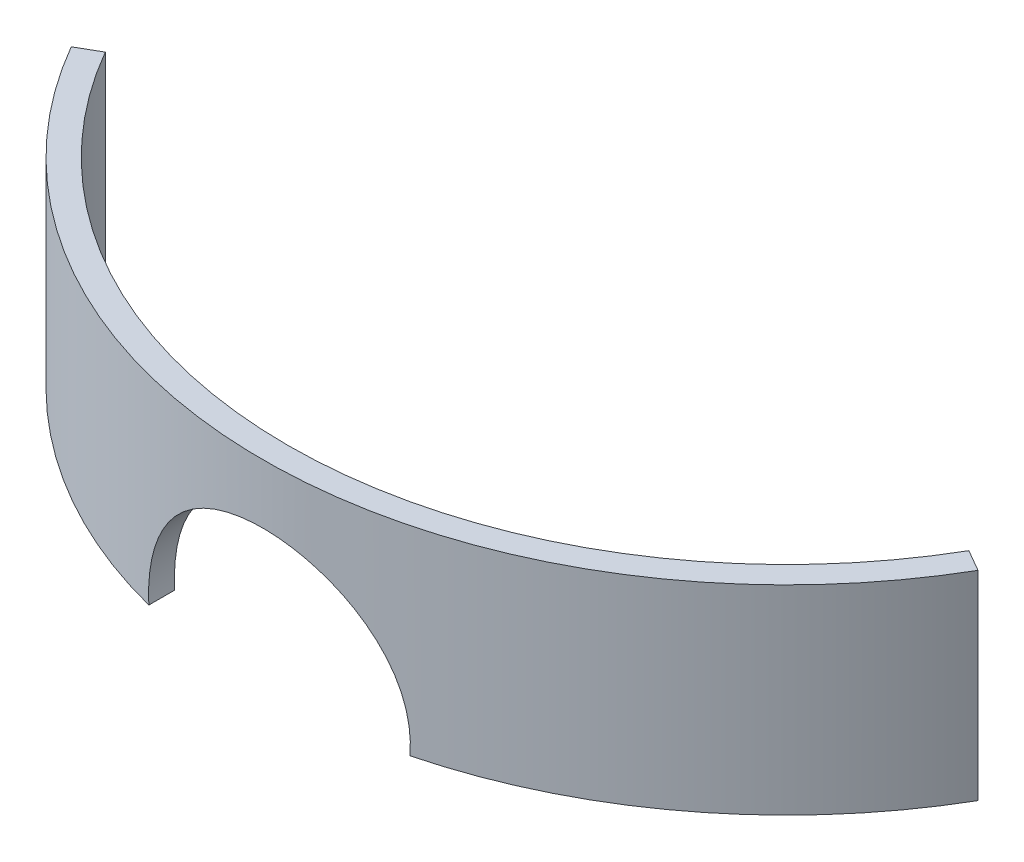
ISO-10303-21;
HEADER;
FILE_DESCRIPTION(('STEP AP214'),'2;1');
FILE_NAME('part.step','',(''),(''),'','','');
FILE_SCHEMA(('AUTOMOTIVE_DESIGN { 1 0 10303 214 1 1 1 1 }'));
ENDSEC;
DATA;
#1=APPLICATION_CONTEXT('core data for automotive mechanical design processes');
#2=APPLICATION_PROTOCOL_DEFINITION('international standard','automotive_design',2000,#1);
#3=PRODUCT_CONTEXT('',#1,'mechanical');
#4=PRODUCT('Part','Part','',(#3));
#5=PRODUCT_RELATED_PRODUCT_CATEGORY('part','',(#4));
#6=PRODUCT_DEFINITION_FORMATION('','',#4);
#7=PRODUCT_DEFINITION_CONTEXT('part definition',#1,'design');
#8=PRODUCT_DEFINITION('design','',#6,#7);
#9=PRODUCT_DEFINITION_SHAPE('','',#8);
#10=(LENGTH_UNIT() NAMED_UNIT(*) SI_UNIT(.MILLI.,.METRE.));
#11=(NAMED_UNIT(*) PLANE_ANGLE_UNIT() SI_UNIT($,.RADIAN.));
#12=(NAMED_UNIT(*) SI_UNIT($,.STERADIAN.) SOLID_ANGLE_UNIT());
#13=UNCERTAINTY_MEASURE_WITH_UNIT(LENGTH_MEASURE(1.E-05),#10,'distance_accuracy_value','');
#14=(GEOMETRIC_REPRESENTATION_CONTEXT(3) GLOBAL_UNCERTAINTY_ASSIGNED_CONTEXT((#13)) GLOBAL_UNIT_ASSIGNED_CONTEXT((#10,
#11,#12)) REPRESENTATION_CONTEXT('',''));
#15=CARTESIAN_POINT('',(0.,0.,0.));
#16=DIRECTION('',(0.,0.,1.));
#17=DIRECTION('',(1.,0.,0.));
#18=AXIS2_PLACEMENT_3D('',#15,#16,#17);
#19=CARTESIAN_POINT('',(0.,36.5,0.));
#20=DIRECTION('',(0.,1.,0.));
#21=DIRECTION('',(0.,0.,1.));
#22=AXIS2_PLACEMENT_3D('',#19,#20,#21);
#23=PLANE('',#22);
#24=CARTESIAN_POINT('',(0.,36.5,0.));
#25=DIRECTION('',(0.,1.,0.));
#26=DIRECTION('',(0.,0.,1.));
#27=AXIS2_PLACEMENT_3D('',#24,#25,#26);
#28=CIRCLE('',#27,40.);
#29=CARTESIAN_POINT('',(-34.6410161513776,36.5,19.9999999999999));
#30=VERTEX_POINT('',#29);
#31=CARTESIAN_POINT('',(-10.4731800328267,36.5,38.6045657921443));
#32=VERTEX_POINT('',#31);
#33=EDGE_CURVE('E187',#30,#32,#28,.T.);
#34=ORIENTED_EDGE('',*,*,#33,.T.);
#35=DIRECTION('',(0.,0.,1.));
#36=VECTOR('',#35,1.);
#37=CARTESIAN_POINT('',(-10.4731800328267,36.5,38.));
#38=LINE('',#37,#36);
#39=CARTESIAN_POINT('',(-10.4731800328267,36.5,40.6732405888687));
#40=VERTEX_POINT('',#39);
#41=EDGE_CURVE('E49',#40,#32,#38,.F.);
#42=ORIENTED_EDGE('',*,*,#41,.F.);
#43=CARTESIAN_POINT('',(0.,36.5,0.));
#44=DIRECTION('',(0.,1.,0.));
#45=DIRECTION('',(0.,0.,1.));
#46=AXIS2_PLACEMENT_3D('',#43,#44,#45);
#47=CIRCLE('',#46,42.);
#48=CARTESIAN_POINT('',(-36.3730669589465,36.5,20.9999999999999));
#49=VERTEX_POINT('',#48);
#50=EDGE_CURVE('E55',#40,#49,#47,.F.);
#51=ORIENTED_EDGE('',*,*,#50,.T.);
#52=DIRECTION('',(-0.86602540378444,0.,0.499999999999998));
#53=VECTOR('',#52,1.);
#54=CARTESIAN_POINT('',(0.,36.5,0.));
#55=LINE('',#54,#53);
#56=EDGE_CURVE('E133',#30,#49,#55,.T.);
#57=ORIENTED_EDGE('',*,*,#56,.F.);
#58=EDGE_LOOP('',(#34,#42,#51,#57));
#59=FACE_BOUND('',#58,.T.);
#60=ADVANCED_FACE('F45',(#59),#23,.F.);
#61=CARTESIAN_POINT('',(10.4731800328267,36.5,38.6045657921443));
#62=VERTEX_POINT('',#61);
#63=CARTESIAN_POINT('',(34.6410161513776,36.5,19.9999999999999));
#64=VERTEX_POINT('',#63);
#65=EDGE_CURVE('E190',#62,#64,#28,.T.);
#66=ORIENTED_EDGE('',*,*,#65,.T.);
#67=DIRECTION('',(0.86602540378444,0.,0.499999999999998));
#68=VECTOR('',#67,1.);
#69=CARTESIAN_POINT('',(0.,36.5,0.));
#70=LINE('',#69,#68);
#71=CARTESIAN_POINT('',(36.3730669589465,36.5,20.9999999999999));
#72=VERTEX_POINT('',#71);
#73=EDGE_CURVE('E110',#64,#72,#70,.T.);
#74=ORIENTED_EDGE('',*,*,#73,.T.);
#75=CARTESIAN_POINT('',(10.4731800328267,36.5,40.6732405888687));
#76=VERTEX_POINT('',#75);
#77=EDGE_CURVE('E12',#72,#76,#47,.F.);
#78=ORIENTED_EDGE('',*,*,#77,.T.);
#79=DIRECTION('',(0.,0.,1.));
#80=VECTOR('',#79,1.);
#81=CARTESIAN_POINT('',(10.4731800328267,36.5,38.));
#82=LINE('',#81,#80);
#83=EDGE_CURVE('E70',#62,#76,#82,.T.);
#84=ORIENTED_EDGE('',*,*,#83,.F.);
#85=EDGE_LOOP('',(#66,#74,#78,#84));
#86=FACE_BOUND('',#85,.T.);
#87=ADVANCED_FACE('F47',(#86),#23,.F.);
#88=CARTESIAN_POINT('',(0.,37.25,38.));
#89=DIRECTION('',(0.,0.,1.));
#90=DIRECTION('',(1.,0.,0.));
#91=AXIS2_PLACEMENT_3D('',#88,#89,#90);
#92=CYLINDRICAL_SURFACE('',#91,10.5);
#93=CARTESIAN_POINT('',(10.5,37.25,40.6663251351779));
#94=CARTESIAN_POINT('',(10.49999876565,37.539930966892,40.6663258994178));
#95=CARTESIAN_POINT('',(10.4879811835644,37.829886594567,40.6694341838603));
#96=CARTESIAN_POINT('',(10.4400096313822,38.407698066371,40.6817747835226));
#97=CARTESIAN_POINT('',(10.4040529167803,38.6955536659162,40.691007800913));
#98=CARTESIAN_POINT('',(10.3084863846881,39.2672076169297,40.715323130303));
#99=CARTESIAN_POINT('',(10.2488648562142,39.5510038874126,40.7304083382868));
#100=CARTESIAN_POINT('',(10.1064647926944,40.1123821028593,40.7659753539258));
#101=CARTESIAN_POINT('',(10.0236856806036,40.3899638927834,40.7864572960569));
#102=CARTESIAN_POINT('',(9.83576258315023,40.9366249188232,40.8321822092736));
#103=CARTESIAN_POINT('',(9.73064855122444,41.2057149935392,40.8574187987989));
#104=CARTESIAN_POINT('',(9.49879553260811,41.7339816969109,40.9119427018794));
#105=CARTESIAN_POINT('',(9.37205643161799,41.9931582731597,40.9412300368447));
#106=CARTESIAN_POINT('',(9.09789946782641,42.4998757543217,41.0030237527122));
#107=CARTESIAN_POINT('',(8.95048471642567,42.7474184025115,41.0355296490492));
#108=CARTESIAN_POINT('',(8.63593646788612,43.2294187026802,41.1028766535426));
#109=CARTESIAN_POINT('',(8.46879643879707,43.4638719820915,41.1377185335921));
#110=CARTESIAN_POINT('',(8.11247284094553,43.9226147797853,41.2094825190038));
#111=CARTESIAN_POINT('',(7.92292004464524,44.146613289811,41.2464320754733));
#112=CARTESIAN_POINT('',(7.52577773862763,44.5779336907137,41.3207389842765));
#113=CARTESIAN_POINT('',(7.31818803569293,44.7852554028973,41.358096340975));
#114=CARTESIAN_POINT('',(6.88627382126853,45.1819118671456,41.4322005749668));
#115=CARTESIAN_POINT('',(6.66194482256683,45.3712417650955,41.4689472853163));
#116=CARTESIAN_POINT('',(6.19814207443449,45.7305101006566,41.5408001243608));
#117=CARTESIAN_POINT('',(5.95867366473017,45.9004553166646,41.5759068239803));
#118=CARTESIAN_POINT('',(5.46258913082245,46.2221090069665,41.6440112735241));
#119=CARTESIAN_POINT('',(5.20577809053642,46.3735249088809,41.6769720859321));
#120=CARTESIAN_POINT('',(4.67986291381815,46.6541328473766,41.739297921382));
#121=CARTESIAN_POINT('',(4.41075862798324,46.783324613772,41.7686629007069));
#122=CARTESIAN_POINT('',(3.86217426858199,47.0184520218932,41.8229549887678));
#123=CARTESIAN_POINT('',(3.58269538187436,47.1243903142991,41.8478826032608));
#124=CARTESIAN_POINT('',(3.01535083082675,47.3121536734467,41.8925842343201));
#125=CARTESIAN_POINT('',(2.72748536142295,47.3939793001682,41.9123583705668));
#126=CARTESIAN_POINT('',(2.15139839462525,47.5314100457595,41.945834598986));
#127=CARTESIAN_POINT('',(1.86330222869606,47.5875127270053,41.9596515761009));
#128=CARTESIAN_POINT('',(1.28320599123755,47.6754226633,41.9813961063182));
#129=CARTESIAN_POINT('',(0.991205967432573,47.7072302150791,41.9893237313504));
#130=CARTESIAN_POINT('',(0.40550358689464,47.7462707435253,41.9990635756304));
#131=CARTESIAN_POINT('',(0.111801454152335,47.7535068832951,42.0008765820189));
#132=CARTESIAN_POINT('',(-0.475147856371557,47.7433495336084,41.9983375773534));
#133=CARTESIAN_POINT('',(-0.768395039757887,47.7259563500237,41.9939856428618));
#134=CARTESIAN_POINT('',(-1.34575552096959,47.6673538160739,41.979405434013));
#135=CARTESIAN_POINT('',(-1.62992697033254,47.6266823678564,41.9693099100779));
#136=CARTESIAN_POINT('',(-2.19374210007774,47.52227777158,41.9436185028907));
#137=CARTESIAN_POINT('',(-2.47338585888854,47.458545023436,41.9280227150208));
#138=CARTESIAN_POINT('',(-3.02622570697781,47.308528584417,41.8917498488724));
#139=CARTESIAN_POINT('',(-3.29942158288901,47.2222441484204,41.8710726027008));
#140=CARTESIAN_POINT('',(-3.83751923654744,47.0277957436901,41.8251882202315));
#141=CARTESIAN_POINT('',(-4.10242089634325,46.9196314639679,41.7999810195481));
#142=CARTESIAN_POINT('',(-4.62448807755313,46.6811817684835,41.7454620950081));
#143=CARTESIAN_POINT('',(-4.88156462268641,46.5507094368611,41.7161160900265));
#144=CARTESIAN_POINT('',(-5.38393096394505,46.2692141539857,41.6542599459473));
#145=CARTESIAN_POINT('',(-5.6292163390553,46.118183574644,41.6217486336509));
#146=CARTESIAN_POINT('',(-6.10628012775464,45.7966986438378,41.5544386000016));
#147=CARTESIAN_POINT('',(-6.33806202809607,45.6262493404084,41.519640474113));
#148=CARTESIAN_POINT('',(-6.7868390408404,45.2669496137576,41.4486484798765));
#149=CARTESIAN_POINT('',(-7.00382731085306,45.0780907725207,41.4124539776302));
#150=CARTESIAN_POINT('',(-7.42721045725944,44.6778985229277,41.3386498357945));
#151=CARTESIAN_POINT('',(-7.63315899855915,44.4660948106937,41.3010284250394));
#152=CARTESIAN_POINT('',(-8.02644560431087,44.0259309074279,41.2264020673759));
#153=CARTESIAN_POINT('',(-8.21379171966896,43.7975779533833,41.1893968596045));
#154=CARTESIAN_POINT('',(-8.56878352344797,43.3256216499892,41.1170133909128));
#155=CARTESIAN_POINT('',(-8.73641981607102,43.0820111113815,41.0816359107924));
#156=CARTESIAN_POINT('',(-9.05063830179159,42.5813469643087,41.0135561744513));
#157=CARTESIAN_POINT('',(-9.1972287308938,42.3242986685376,40.9808528738961));
#158=CARTESIAN_POINT('',(-9.46903659052353,41.7970599244201,40.9189062196095));
#159=CARTESIAN_POINT('',(-9.59414167810802,41.526809354275,40.8896812838975));
#160=CARTESIAN_POINT('',(-9.82108014432877,40.9762626549945,40.8357686175122));
#161=CARTESIAN_POINT('',(-9.92291337568064,40.6959664622947,40.8110809155548));
#162=CARTESIAN_POINT('',(-10.1024487792678,40.1273926581839,40.7670097127501));
#163=CARTESIAN_POINT('',(-10.1801551835511,39.8391164562066,40.7476252817356));
#164=CARTESIAN_POINT('',(-10.3107871355234,39.2566732340095,40.7147665495915));
#165=CARTESIAN_POINT('',(-10.3637133369938,38.9625063694179,40.7012920925384));
#166=CARTESIAN_POINT('',(-10.4432482414696,38.3783406813589,40.6809562862066));
#167=CARTESIAN_POINT('',(-10.4705154096398,38.0884371200137,40.6739295988705));
#168=CARTESIAN_POINT('',(-10.5008792342442,37.5072848751172,40.666101177457));
#169=CARTESIAN_POINT('',(-10.5039763144121,37.2160362152369,40.6652993342497));
#170=CARTESIAN_POINT('',(-10.4859741432635,36.6343640736992,40.669945054543));
#171=CARTESIAN_POINT('',(-10.464876947035,36.3439405240565,40.6753920872573));
#172=CARTESIAN_POINT('',(-10.3986734393912,35.7660249002392,40.6923672851));
#173=CARTESIAN_POINT('',(-10.3535672336683,35.4785328131654,40.7038954234581));
#174=CARTESIAN_POINT('',(-10.240667014885,34.9132390683719,40.7324448490815));
#175=CARTESIAN_POINT('',(-10.1732572464013,34.6353558111297,40.7493729401351));
#176=CARTESIAN_POINT('',(-10.0161263410345,34.0863407735608,40.7882796527726));
#177=CARTESIAN_POINT('',(-9.92640551517418,33.8152088991759,40.8102582039514));
#178=CARTESIAN_POINT('',(-9.7253525920657,33.2815213303243,40.8586367518171));
#179=CARTESIAN_POINT('',(-9.61402248528011,33.0189648485658,40.885036341245));
#180=CARTESIAN_POINT('',(-9.37051888907937,32.5039984009451,40.9415314030219));
#181=CARTESIAN_POINT('',(-9.23833744183229,32.2515923552997,40.9716282854539));
#182=CARTESIAN_POINT('',(-8.95135579942736,31.753880994851,41.0352925642836));
#183=CARTESIAN_POINT('',(-8.79617001050306,31.5088051004619,41.0689155050676));
#184=CARTESIAN_POINT('',(-8.46614461934886,31.0324117825139,41.1382161418834));
#185=CARTESIAN_POINT('',(-8.29129615560716,30.8011006347984,41.1738947608008));
#186=CARTESIAN_POINT('',(-7.92314212613811,30.3537882300663,41.246321153006));
#187=CARTESIAN_POINT('',(-7.72983388800981,30.1377891976777,41.2830690805593));
#188=CARTESIAN_POINT('',(-7.3261237291588,29.7226021926748,41.3566195699105));
#189=CARTESIAN_POINT('',(-7.11572921467841,29.5234070117708,41.3934221013199));
#190=CARTESIAN_POINT('',(-6.67354129401005,29.1381564159564,41.4670392172104));
#191=CARTESIAN_POINT('',(-6.44133918398516,28.9525652449502,41.5038302059524));
#192=CARTESIAN_POINT('',(-5.96192521021523,28.6016673667213,41.5754032545602));
#193=CARTESIAN_POINT('',(-5.71471894947814,28.4363531562844,41.6101860549917));
#194=CARTESIAN_POINT('',(-5.20683659069902,28.1271024556336,41.6767854631102));
#195=CARTESIAN_POINT('',(-4.94615829097185,27.9831694746607,41.7086015835661));
#196=CARTESIAN_POINT('',(-4.41316021900737,27.7178104171296,41.7683602504002));
#197=CARTESIAN_POINT('',(-4.14084061901733,27.596384007701,41.7963028540658));
#198=CARTESIAN_POINT('',(-3.58850590466417,27.3778072486205,41.847329339802));
#199=CARTESIAN_POINT('',(-3.30856170675119,27.2804857165716,41.8704472881012));
#200=CARTESIAN_POINT('',(-2.74108906656812,27.1097722283721,41.9114226213314));
#201=CARTESIAN_POINT('',(-2.45356063989941,27.0363802230006,41.9292800170828));
#202=CARTESIAN_POINT('',(-1.87307898335729,26.9141626169062,41.959218536774));
#203=CARTESIAN_POINT('',(-1.58012663397698,26.8653330644658,41.9713005898613));
#204=CARTESIAN_POINT('',(-0.99095446536132,26.7926530697666,41.9893422255741));
#205=CARTESIAN_POINT('',(-0.694734717905107,26.7688020798716,41.9953019424272));
#206=CARTESIAN_POINT('',(-0.109318549696251,26.7465949303237,42.0008501256156));
#207=CARTESIAN_POINT('',(0.17985098154051,26.7475662493294,42.0006066580087));
#208=CARTESIAN_POINT('',(0.757054952746141,26.7733439879946,41.9941682227566));
#209=CARTESIAN_POINT('',(1.04508941447114,26.798149948557,41.9879733697454));
#210=CARTESIAN_POINT('',(1.61794151912378,26.8713851923197,41.9698033174631));
#211=CARTESIAN_POINT('',(1.90275927399182,26.9198136508566,41.9578283199775));
#212=CARTESIAN_POINT('',(2.46716865801495,27.0398910769454,41.9284263935882));
#213=CARTESIAN_POINT('',(2.7467602637522,27.1115401485201,41.910999440261));
#214=CARTESIAN_POINT('',(3.2972771815532,27.2770299231337,41.8712756153804));
#215=CARTESIAN_POINT('',(3.56824122258445,27.3707483606933,41.8490056247451));
#216=CARTESIAN_POINT('',(4.10126196907902,27.5798598126271,41.8001349613551));
#217=CARTESIAN_POINT('',(4.36331873390184,27.6952526825259,41.7735343174676));
#218=CARTESIAN_POINT('',(4.87679979927522,27.9468521673157,41.7167058879834));
#219=CARTESIAN_POINT('',(5.12822500756022,28.0830570006574,41.6864784128989));
#220=CARTESIAN_POINT('',(5.6189656782439,28.3753828567869,41.6231722428436));
#221=CARTESIAN_POINT('',(5.85827647909167,28.5315114659747,41.5900924633616));
#222=CARTESIAN_POINT('',(6.3286787479458,28.8664954519473,41.5211471687502));
#223=CARTESIAN_POINT('',(6.55944388082957,29.0457994922279,41.4852343926851));
#224=CARTESIAN_POINT('',(7.00523466480502,29.4229966860375,41.4122896715305));
#225=CARTESIAN_POINT('',(7.22025307930323,29.6208982920938,41.3752572227906));
#226=CARTESIAN_POINT('',(7.63309832125273,30.033969435788,41.3010873515787));
#227=CARTESIAN_POINT('',(7.8309208931041,30.2491432227194,41.2639499054568));
#228=CARTESIAN_POINT('',(8.20793114426395,30.6952223273811,41.1906147063505));
#229=CARTESIAN_POINT('',(8.3871270541454,30.9261206216207,41.1544165436758));
#230=CARTESIAN_POINT('',(8.72901631752263,31.4068063060558,41.0832734011077));
#231=CARTESIAN_POINT('',(8.89132856572894,31.6568704741054,41.048365622754));
#232=CARTESIAN_POINT('',(9.19420457392386,32.1701031945705,40.9815892172669));
#233=CARTESIAN_POINT('',(9.33477643455901,32.4332668174732,40.9497194598482));
#234=CARTESIAN_POINT('',(9.59311229004219,32.9708534316127,40.88997157344));
#235=CARTESIAN_POINT('',(9.7108862650698,33.245271431996,40.862091699208));
#236=CARTESIAN_POINT('',(9.92274327943157,33.803514511397,40.8111633535301));
#237=CARTESIAN_POINT('',(10.0168299305722,34.08733814878,40.7881141456015));
#238=CARTESIAN_POINT('',(10.1650451363864,34.6079134478546,40.7513988738351));
#239=CARTESIAN_POINT('',(10.2233655164882,34.843414796281,40.736782642908));
#240=CARTESIAN_POINT('',(10.3235915808394,35.3180884545697,40.711498824818));
#241=CARTESIAN_POINT('',(10.365498431753,35.5572605022646,40.7008309570107));
#242=CARTESIAN_POINT('',(10.4326526665267,36.0381033942653,40.6836694772977));
#243=CARTESIAN_POINT('',(10.4578985582345,36.2797744604147,40.6771762392725));
#244=CARTESIAN_POINT('',(10.4915705512623,36.7642914648435,40.6685043100736));
#245=CARTESIAN_POINT('',(10.5000010339628,37.0071370805498,40.6663244950064));
#246=CARTESIAN_POINT('',(10.5,37.25,40.6663251351779));
#247=B_SPLINE_CURVE_WITH_KNOTS('',3,(#93,#94,#95,#96,#97,#98,#99,#100,#101,#102,#103,#104,#105,
#106,#107,#108,#109,#110,#111,#112,#113,#114,#115,#116,#117,#118,#119,#120,#121,#122,#123,#124,
#125,#126,#127,#128,#129,#130,#131,#132,#133,#134,#135,#136,#137,#138,#139,#140,#141,#142,#143,
#144,#145,#146,#147,#148,#149,#150,#151,#152,#153,#154,#155,#156,#157,#158,#159,#160,#161,#162,
#163,#164,#165,#166,#167,#168,#169,#170,#171,#172,#173,#174,#175,#176,#177,#178,#179,#180,#181,
#182,#183,#184,#185,#186,#187,#188,#189,#190,#191,#192,#193,#194,#195,#196,#197,#198,#199,#200,
#201,#202,#203,#204,#205,#206,#207,#208,#209,#210,#211,#212,#213,#214,#215,#216,#217,#218,#219,
#220,#221,#222,#223,#224,#225,#226,#227,#228,#229,#230,#231,#232,#233,#234,#235,#236,#237,#238,
#239,#240,#241,#242,#243,#244,#245,#246),.UNSPECIFIED.,.T.,.F.,(4,2,2,2,2,2,2,2,2,2,2,2,2,2,2,2,
2,2,2,2,2,2,2,2,2,2,2,2,2,2,2,2,2,2,2,2,2,2,2,2,2,2,2,2,2,2,2,2,2,2,2,2,2,2,2,2,2,2,2,2,2,2,2,2,
2,2,2,2,2,2,2,2,2,2,2,2,4),(0.,0.869570966645742,1.73924164255169,2.60934322920117,
3.47946649912938,4.34843012699018,5.21739834791168,6.08623594110854,6.95536205814345,
7.84160069388764,8.72784882448756,9.61433538621905,10.5005110066023,11.3992450669725,
12.2979900527743,13.1966325367294,14.0952541494435,14.9756727619092,15.8560806211508,
16.7363751402962,17.6166587271491,18.4773781377671,19.338082623038,20.1988155501121,
21.0595607120504,21.9279070918617,22.7965765522889,23.6650207089843,24.5338638533958,
25.4262485957709,26.3182454258246,27.2106657670332,28.1027359144677,28.9993371983855,
29.8959441566134,30.792393753488,31.6888196978025,32.5615582493555,33.4342815006127,
34.3069306273097,35.1795759124708,36.0379086316372,36.8962293860642,37.7544711167946,
38.6130411880936,39.4880978199538,40.3635504120943,41.2391299352225,42.114331933625,
43.0118385541862,43.9090120562103,44.8063326464882,45.7036399644034,46.5943794730311,
47.4851171494773,48.3757114741838,49.2662862728693,50.1327585863245,50.9992142103355,
51.8656395884683,52.7320688480308,53.5938065106701,54.4555384294263,55.3171966233493,
56.179183896387,57.0614730688231,57.9441651960182,58.8270751522094,59.7095933030719,
60.6089877316814,61.508046226944,62.4067102488474,63.3052371607493,64.0338164378976,
64.7623439186472,65.4909366373303,66.2193394909219),.UNSPECIFIED.);
#248=EDGE_CURVE('E143',#76,#40,#247,.T.);
#249=ORIENTED_EDGE('',*,*,#248,.T.);
#250=ORIENTED_EDGE('',*,*,#41,.T.);
#251=CARTESIAN_POINT('',(10.5,37.25,38.5972796968905));
#252=CARTESIAN_POINT('',(10.4999988988291,36.960588736193,38.5972804118852));
#253=CARTESIAN_POINT('',(10.4880242542829,36.6711561952156,38.6005436760224));
#254=CARTESIAN_POINT('',(10.4402268169875,36.0943966014271,38.6134984866802));
#255=CARTESIAN_POINT('',(10.4044016647375,35.8070697597737,38.6231906692053));
#256=CARTESIAN_POINT('',(10.309193895277,35.2364929140457,38.6487121090586));
#257=CARTESIAN_POINT('',(10.2498009040451,34.9532447622905,38.6645440689059));
#258=CARTESIAN_POINT('',(10.1079593002466,34.3929605711699,38.7018672443314));
#259=CARTESIAN_POINT('',(10.0255100817516,34.1159246952726,38.7233586086405));
#260=CARTESIAN_POINT('',(9.83836126756043,33.5703674169638,38.7713290484119));
#261=CARTESIAN_POINT('',(9.73369345673661,33.3018344746808,38.7978009928054));
#262=CARTESIAN_POINT('',(9.50284602422747,32.7746538587194,38.8549874233173));
#263=CARTESIAN_POINT('',(9.37666631224731,32.5160062265394,38.8857019272437));
#264=CARTESIAN_POINT('',(9.10373620116321,32.0102922066558,38.9505025215734));
#265=CARTESIAN_POINT('',(8.95698839892894,31.7632243621672,38.9845881861838));
#266=CARTESIAN_POINT('',(8.64387802325474,31.2821040493618,39.0552061574075));
#267=CARTESIAN_POINT('',(8.47750893959654,31.0480559390321,39.0917392743235));
#268=CARTESIAN_POINT('',(8.12247452611873,30.5895730615738,39.1670657491212));
#269=CARTESIAN_POINT('',(7.93340312265272,30.3654578849386,39.205890977363));
#270=CARTESIAN_POINT('',(7.53723018176892,29.9338553302547,39.2839778285451));
#271=CARTESIAN_POINT('',(7.33012843072499,29.7263681492727,39.3232394566512));
#272=CARTESIAN_POINT('',(6.89918025409599,29.3293198117377,39.401132718749));
#273=CARTESIAN_POINT('',(6.67532921559465,29.1397636263427,39.4397641755908));
#274=CARTESIAN_POINT('',(6.21245643152511,28.7799775962954,39.5153178719275));
#275=CARTESIAN_POINT('',(5.97344003477036,28.6097409960632,39.552240706194));
#276=CARTESIAN_POINT('',(5.47784334011696,28.287187392296,39.6239433634876));
#277=CARTESIAN_POINT('',(5.22104609673663,28.1351939365033,39.6586804048599));
#278=CARTESIAN_POINT('',(4.69506239537988,27.8534367901946,39.724383231993));
#279=CARTESIAN_POINT('',(4.42587577047835,27.7236733993009,39.7553489669214));
#280=CARTESIAN_POINT('',(3.8770308849222,27.4874245822639,39.8126203496639));
#281=CARTESIAN_POINT('',(3.59737394972804,27.3809362212738,39.8389265849345));
#282=CARTESIAN_POINT('',(3.02957806256849,27.1921094949666,39.8861228476483));
#283=CARTESIAN_POINT('',(2.74143932904096,27.109770508311,39.9070130144399));
#284=CARTESIAN_POINT('',(2.16530281060098,26.9715144041604,39.9423697233158));
#285=CARTESIAN_POINT('',(1.87744429406445,26.9150505978917,39.9569687441281));
#286=CARTESIAN_POINT('',(1.29776957569475,26.8263844979196,39.9799940258045));
#287=CARTESIAN_POINT('',(1.00595342701575,26.7941818786968,39.988420369489));
#288=CARTESIAN_POINT('',(0.420576252248345,26.7543262155735,39.9988599510817));
#289=CARTESIAN_POINT('',(0.12701547825227,26.7466697072906,40.0008740939931));
#290=CARTESIAN_POINT('',(-0.459687012780373,26.7559654663747,39.9984342133306));
#291=CARTESIAN_POINT('',(-0.752828735532976,26.7729173948035,39.9939802788432));
#292=CARTESIAN_POINT('',(-1.32934623179409,26.8305613952246,39.9789188671051));
#293=CARTESIAN_POINT('',(-1.61278538800602,26.8706620609276,39.9684647207168));
#294=CARTESIAN_POINT('',(-2.17517792240971,26.973797908393,39.9418057954001));
#295=CARTESIAN_POINT('',(-2.45413138627275,27.0368326515977,39.9256011264364));
#296=CARTESIAN_POINT('',(-3.00564214893487,27.185325428069,39.8878743835428));
#297=CARTESIAN_POINT('',(-3.27819922795917,27.2707842305833,39.8663521271968));
#298=CARTESIAN_POINT('',(-3.81508325126481,27.4634538647988,39.8185607714844));
#299=CARTESIAN_POINT('',(-4.07941006875845,27.5706650314056,39.7922915990339));
#300=CARTESIAN_POINT('',(-4.60057820871583,27.8071538468997,39.7354256433297));
#301=CARTESIAN_POINT('',(-4.85732447334201,27.9366315958802,39.7047900909808));
#302=CARTESIAN_POINT('',(-5.35911429168386,28.2160421963532,39.6401806316754));
#303=CARTESIAN_POINT('',(-5.60415345922811,28.3659826344905,39.6062054878617));
#304=CARTESIAN_POINT('',(-6.08083171081269,28.685203033826,39.5358258331765));
#305=CARTESIAN_POINT('',(-6.31247407242749,28.8544782343006,39.4994219212453));
#306=CARTESIAN_POINT('',(-6.76109512350439,29.2113564842006,39.4251103136757));
#307=CARTESIAN_POINT('',(-6.97806702023112,29.3989679267008,39.387201934155));
#308=CARTESIAN_POINT('',(-7.40212809850155,29.7971090117485,39.3097486346109));
#309=CARTESIAN_POINT('',(-7.60872997728394,30.0081550709525,39.2701886130634));
#310=CARTESIAN_POINT('',(-8.00339118382199,30.4468574649948,39.19165990486));
#311=CARTESIAN_POINT('',(-8.19145849085652,30.6745065779919,39.1526909699041));
#312=CARTESIAN_POINT('',(-8.54796637409435,31.1451284742326,39.0764062720217));
#313=CARTESIAN_POINT('',(-8.71639737384995,31.3881086460058,39.0390913211808));
#314=CARTESIAN_POINT('',(-9.03227391682286,31.8876021813979,38.9672203940697));
#315=CARTESIAN_POINT('',(-9.17972769372799,32.1441101807721,38.9326633376603));
#316=CARTESIAN_POINT('',(-9.45346084206937,32.6706284315947,38.8671071366863));
#317=CARTESIAN_POINT('',(-9.579606715178,32.9407109810214,38.8361307816699));
#318=CARTESIAN_POINT('',(-9.80862964286688,33.4910617710289,38.778921179447));
#319=CARTESIAN_POINT('',(-9.91150652785986,33.7713300858274,38.7526879668096));
#320=CARTESIAN_POINT('',(-10.0931099008294,34.3399829172017,38.7057868538149));
#321=CARTESIAN_POINT('',(-10.171841123555,34.628365830453,38.6851178624607));
#322=CARTESIAN_POINT('',(-10.3044849610585,35.211154572231,38.6499975126468));
#323=CARTESIAN_POINT('',(-10.3583983072895,35.5055602229833,38.6355459709421));
#324=CARTESIAN_POINT('',(-10.4397184504972,36.0895448758809,38.6136504067476));
#325=CARTESIAN_POINT('',(-10.4678488509312,36.3790161222289,38.60601525275));
#326=CARTESIAN_POINT('',(-10.5000003927758,36.9593909657111,38.5972832395863));
#327=CARTESIAN_POINT('',(-10.5040219983651,37.2502945351602,38.5961862545375));
#328=CARTESIAN_POINT('',(-10.4879213385681,37.8313539320008,38.6005644215068));
#329=CARTESIAN_POINT('',(-10.4678013505869,38.121509827337,38.6060389535986));
#330=CARTESIAN_POINT('',(-10.4036003244964,38.6989625636521,38.6233893242447));
#331=CARTESIAN_POINT('',(-10.3595194109509,38.9862594194861,38.6352651295212));
#332=CARTESIAN_POINT('',(-10.2488176345977,39.5506295921539,38.6647765636766));
#333=CARTESIAN_POINT('',(-10.1826292058505,39.8277937110222,38.6823014794278));
#334=CARTESIAN_POINT('',(-10.0280815038096,40.3754661121342,38.7226542573518));
#335=CARTESIAN_POINT('',(-9.93972257758348,40.6459744984971,38.7454820365106));
#336=CARTESIAN_POINT('',(-9.74152910507761,41.1785276828052,38.7957865383936));
#337=CARTESIAN_POINT('',(-9.63169638538556,41.4405731984052,38.8232628656798));
#338=CARTESIAN_POINT('',(-9.39131761713146,41.9546467693421,38.8821097816595));
#339=CARTESIAN_POINT('',(-9.26076364601711,42.2066709468489,38.9134818588495));
#340=CARTESIAN_POINT('',(-8.97693992321169,42.7041985556696,38.9799464730512));
#341=CARTESIAN_POINT('',(-8.82325126594138,42.9494544557156,39.0151032277191));
#342=CARTESIAN_POINT('',(-8.49626181758684,43.4263388470363,39.0876141805033));
#343=CARTESIAN_POINT('',(-8.32295218972968,43.657961126135,39.1249693650693));
#344=CARTESIAN_POINT('',(-7.95789762584339,44.1060476677683,39.2008496816606));
#345=CARTESIAN_POINT('',(-7.76614974398576,44.3225094985802,39.2393749999601));
#346=CARTESIAN_POINT('',(-7.36556144706383,44.7387856513657,39.3165370401054));
#347=CARTESIAN_POINT('',(-7.15672838846519,44.9386070642928,39.3551737071652));
#348=CARTESIAN_POINT('',(-6.71705386972984,45.3258540020258,39.4326312122448));
#349=CARTESIAN_POINT('',(-6.48575613547957,45.5127670827625,39.4714261828532));
#350=CARTESIAN_POINT('',(-6.00801404941137,45.8663829722254,39.5469622250714));
#351=CARTESIAN_POINT('',(-5.76157533650401,46.0330932370917,39.5837040517092));
#352=CARTESIAN_POINT('',(-5.25507417716581,46.345201801751,39.6541242474078));
#353=CARTESIAN_POINT('',(-4.99500948718454,46.4905965768333,39.6878021094656));
#354=CARTESIAN_POINT('',(-4.46307080009893,46.7589292112882,39.7511349257191));
#355=CARTESIAN_POINT('',(-4.19119699143205,46.881867428836,39.7807899440761));
#356=CARTESIAN_POINT('',(-3.63963711313081,47.1034614705525,39.8350253299937));
#357=CARTESIAN_POINT('',(-3.3600254899776,47.2022935558185,39.8596423077211));
#358=CARTESIAN_POINT('',(-2.79304419041169,47.3760463533547,39.9033800366491));
#359=CARTESIAN_POINT('',(-2.50567452859275,47.4509671106014,39.9225007981879));
#360=CARTESIAN_POINT('',(-1.92534581265137,47.5762357855691,39.9546928104454));
#361=CARTESIAN_POINT('',(-1.63238776523846,47.626588086494,39.9677651402298));
#362=CARTESIAN_POINT('',(-1.04304636912194,47.7022873558572,39.9874851701363));
#363=CARTESIAN_POINT('',(-0.746663104540553,47.7276349370885,39.9941330277036));
#364=CARTESIAN_POINT('',(-0.161590593797376,47.7527166611656,40.0007115104043));
#365=CARTESIAN_POINT('',(0.127064999445205,47.7531909323934,40.0008362370251));
#366=CARTESIAN_POINT('',(0.703366789096063,47.7303831922576,39.9948535408921));
#367=CARTESIAN_POINT('',(0.991013006755723,47.7071016840959,39.9887462501468));
#368=CARTESIAN_POINT('',(1.56321028291885,47.6369848487074,39.9704679993598));
#369=CARTESIAN_POINT('',(1.84776146598757,47.5901504730185,39.9582972842812));
#370=CARTESIAN_POINT('',(2.41175925372957,47.4733240203232,39.9282252538694));
#371=CARTESIAN_POINT('',(2.69120583552943,47.4033318395748,39.9103239128643));
#372=CARTESIAN_POINT('',(3.24119929191475,47.2413094596859,39.8694139452322));
#373=CARTESIAN_POINT('',(3.51179326648224,47.1494301298818,39.8464403579212));
#374=CARTESIAN_POINT('',(4.04432173748487,46.9440669050746,39.7959172544893));
#375=CARTESIAN_POINT('',(4.3062530682295,46.8305752122051,39.7683660872096));
#376=CARTESIAN_POINT('',(4.81963630621586,46.5828629503079,39.7094178727789));
#377=CARTESIAN_POINT('',(5.0710892076509,46.4486443535612,39.6780211916087));
#378=CARTESIAN_POINT('',(5.56197456637751,46.1604129045635,39.6121922951891));
#379=CARTESIAN_POINT('',(5.80140642565841,46.0063990689131,39.5777599291579));
#380=CARTESIAN_POINT('',(6.27281873647024,45.6753686275874,39.505823224253));
#381=CARTESIAN_POINT('',(6.50444404238042,45.4978584001205,39.4682623191674));
#382=CARTESIAN_POINT('',(6.95200720914083,45.1242977743978,39.3918918762002));
#383=CARTESIAN_POINT('',(7.16794482592089,44.9282470877974,39.3530823189056));
#384=CARTESIAN_POINT('',(7.5828080252647,44.5188359162198,39.2752541147968));
#385=CARTESIAN_POINT('',(7.781729160652,44.305470934452,39.2362354161386));
#386=CARTESIAN_POINT('',(8.16120169364944,43.8628484858333,39.1590639058388));
#387=CARTESIAN_POINT('',(8.34175342585054,43.6335913085799,39.1209110784356));
#388=CARTESIAN_POINT('',(8.68693884104225,43.1555778405745,39.0457292108213));
#389=CARTESIAN_POINT('',(8.85114978515628,42.9065095024728,39.0087416230187));
#390=CARTESIAN_POINT('',(9.15790079668074,42.3950689541618,38.9378689328151));
#391=CARTESIAN_POINT('',(9.30044878673058,42.132701654729,38.9039826979905));
#392=CARTESIAN_POINT('',(9.56280184266563,41.5964790079344,38.8403275484034));
#393=CARTESIAN_POINT('',(9.68261577078583,41.3226281881415,38.8105570304778));
#394=CARTESIAN_POINT('',(9.89858690459552,40.7652899580071,38.7560369503476));
#395=CARTESIAN_POINT('',(9.99474743028171,40.4818039064337,38.731286683585));
#396=CARTESIAN_POINT('',(10.1483090027332,39.9561978097535,38.6913037117552));
#397=CARTESIAN_POINT('',(10.2095216062626,39.7152518276054,38.6751680344901));
#398=CARTESIAN_POINT('',(10.3147364744882,39.2293887918951,38.6472402973885));
#399=CARTESIAN_POINT('',(10.3587399512006,38.9844720192562,38.6354479316615));
#400=CARTESIAN_POINT('',(10.4292609910098,38.4919380376705,38.6164712473086));
#401=CARTESIAN_POINT('',(10.4557773208794,38.244320639522,38.6092872536748));
#402=CARTESIAN_POINT('',(10.4911449969535,37.7478071737198,38.5996917929126));
#403=CARTESIAN_POINT('',(10.5000009470746,37.498911456281,38.5972790819512));
#404=CARTESIAN_POINT('',(10.5,37.25,38.5972796968905));
#405=B_SPLINE_CURVE_WITH_KNOTS('',3,(#251,#252,#253,#254,#255,#256,#257,#258,#259,#260,#261,
#262,#263,#264,#265,#266,#267,#268,#269,#270,#271,#272,#273,#274,#275,#276,#277,#278,#279,#280,
#281,#282,#283,#284,#285,#286,#287,#288,#289,#290,#291,#292,#293,#294,#295,#296,#297,#298,#299,
#300,#301,#302,#303,#304,#305,#306,#307,#308,#309,#310,#311,#312,#313,#314,#315,#316,#317,#318,
#319,#320,#321,#322,#323,#324,#325,#326,#327,#328,#329,#330,#331,#332,#333,#334,#335,#336,#337,
#338,#339,#340,#341,#342,#343,#344,#345,#346,#347,#348,#349,#350,#351,#352,#353,#354,#355,#356,
#357,#358,#359,#360,#361,#362,#363,#364,#365,#366,#367,#368,#369,#370,#371,#372,#373,#374,#375,
#376,#377,#378,#379,#380,#381,#382,#383,#384,#385,#386,#387,#388,#389,#390,#391,#392,#393,#394,
#395,#396,#397,#398,#399,#400,#401,#402,#403,#404),.UNSPECIFIED.,.T.,.F.,(4,2,2,2,2,2,2,2,2,2,2,
2,2,2,2,2,2,2,2,2,2,2,2,2,2,2,2,2,2,2,2,2,2,2,2,2,2,2,2,2,2,2,2,2,2,2,2,2,2,2,2,2,2,2,2,2,2,2,2,
2,2,2,2,2,2,2,2,2,2,2,2,2,2,2,2,2,4),(0.,0.868005652453136,1.73609718837712,2.60457126288124,
3.47306816343381,4.3403309066571,5.20759729025117,6.07475427368512,6.94219978811813,
7.82850263944516,8.7148159932442,9.60137435124388,10.4876217403081,11.3877926771605,
12.2879757457839,13.1880452409544,14.0880915762311,14.968129078031,15.8481547719047,
16.7280562554819,17.6079456200664,18.4662921134657,19.3246221939683,20.1829817229697,
21.041354468518,21.9078879402575,22.7747435608818,23.6413861972599,24.5084273978284,
25.4013109152475,26.2938083445773,27.1867392319127,28.0793186656924,28.9772980494442,
29.8752839775695,30.7730937059046,31.6708769715437,32.5426147434665,33.4143357313299,
34.285974491576,35.1576087205456,36.0131047956475,36.868587479242,37.7239974260461,
38.5797352212061,39.4534161295581,40.3274920981572,41.2017079482026,42.0755493432664,
42.9741795966059,43.8724771809061,44.7709231397697,45.6693547674428,46.5610057676865,
47.4526550907479,48.3441452784079,49.2356136176887,50.1005399603164,50.9654479822019,
51.8303210645344,52.6951980213626,53.5542775673274,54.4136676634974,55.2729760342202,
56.1323271106775,57.0140020122605,57.8956906280675,58.7776089694767,59.6595112442365,
60.5602641122477,61.460686757351,62.3607576736123,63.2607021835431,64.007434980663,
64.7541151768995,65.5008480248304,66.2473861801538),.UNSPECIFIED.);
#406=EDGE_CURVE('E157',#32,#62,#405,.T.);
#407=ORIENTED_EDGE('',*,*,#406,.T.);
#408=ORIENTED_EDGE('',*,*,#83,.T.);
#409=EDGE_LOOP('',(#249,#250,#407,#408));
#410=FACE_BOUND('',#409,.T.);
#411=ADVANCED_FACE('F163',(#410),#92,.F.);
#412=CARTESIAN_POINT('',(0.,0.,0.));
#413=DIRECTION('',(0.499999999999998,0.,0.86602540378444));
#414=DIRECTION('',(0.86602540378444,0.,-0.499999999999998));
#415=AXIS2_PLACEMENT_3D('',#412,#413,#414);
#416=PLANE('',#415);
#417=DIRECTION('',(0.,1.,0.));
#418=VECTOR('',#417,1.);
#419=CARTESIAN_POINT('',(-34.6410161513776,20.5,19.9999999999999));
#420=LINE('',#419,#418);
#421=CARTESIAN_POINT('',(-34.6410161513776,52.5,19.9999999999999));
#422=VERTEX_POINT('',#421);
#423=EDGE_CURVE('E123',#30,#422,#420,.T.);
#424=ORIENTED_EDGE('',*,*,#423,.F.);
#425=ORIENTED_EDGE('',*,*,#56,.T.);
#426=DIRECTION('',(0.,-1.,0.));
#427=VECTOR('',#426,1.);
#428=CARTESIAN_POINT('',(-36.3730669589465,2.,20.9999999999999));
#429=LINE('',#428,#427);
#430=CARTESIAN_POINT('',(-36.3730669589465,52.5,20.9999999999999));
#431=VERTEX_POINT('',#430);
#432=EDGE_CURVE('E116',#49,#431,#429,.F.);
#433=ORIENTED_EDGE('',*,*,#432,.T.);
#434=DIRECTION('',(-0.86602540378444,0.,0.499999999999998));
#435=VECTOR('',#434,1.);
#436=CARTESIAN_POINT('',(-38.0681891470551,52.5,21.9786792516137));
#437=LINE('',#436,#435);
#438=EDGE_CURVE('E115',#422,#431,#437,.T.);
#439=ORIENTED_EDGE('',*,*,#438,.F.);
#440=EDGE_LOOP('',(#424,#425,#433,#439));
#441=FACE_BOUND('',#440,.T.);
#442=ADVANCED_FACE('F167',(#441),#416,.F.);
#443=CARTESIAN_POINT('',(0.,22.,0.));
#444=DIRECTION('',(0.,1.,0.));
#445=DIRECTION('',(0.,0.,1.));
#446=AXIS2_PLACEMENT_3D('',#443,#444,#445);
#447=CYLINDRICAL_SURFACE('',#446,40.);
#448=ORIENTED_EDGE('',*,*,#65,.F.);
#449=ORIENTED_EDGE('',*,*,#406,.F.);
#450=ORIENTED_EDGE('',*,*,#33,.F.);
#451=ORIENTED_EDGE('',*,*,#423,.T.);
#452=CARTESIAN_POINT('',(0.,52.5,0.));
#453=DIRECTION('',(0.,1.,0.));
#454=DIRECTION('',(-0.86602540378444,0.,0.499999999999998));
#455=AXIS2_PLACEMENT_3D('',#452,#453,#454);
#456=CIRCLE('',#455,40.);
#457=CARTESIAN_POINT('',(34.6410161513776,52.5,19.9999999999999));
#458=VERTEX_POINT('',#457);
#459=EDGE_CURVE('E119',#422,#458,#456,.T.);
#460=ORIENTED_EDGE('',*,*,#459,.T.);
#461=DIRECTION('',(0.,1.,0.));
#462=VECTOR('',#461,1.);
#463=CARTESIAN_POINT('',(34.6410161513776,20.5,19.9999999999999));
#464=LINE('',#463,#462);
#465=EDGE_CURVE('E102',#64,#458,#464,.T.);
#466=ORIENTED_EDGE('',*,*,#465,.F.);
#467=EDGE_LOOP('',(#448,#449,#450,#451,#460,#466));
#468=FACE_BOUND('',#467,.T.);
#469=ADVANCED_FACE('F120',(#468),#447,.F.);
#470=CARTESIAN_POINT('',(0.,0.,0.));
#471=DIRECTION('',(0.499999999999998,0.,-0.86602540378444));
#472=DIRECTION('',(-0.86602540378444,0.,-0.499999999999998));
#473=AXIS2_PLACEMENT_3D('',#470,#471,#472);
#474=PLANE('',#473);
#475=ORIENTED_EDGE('',*,*,#73,.F.);
#476=ORIENTED_EDGE('',*,*,#465,.T.);
#477=DIRECTION('',(0.86602540378444,0.,0.499999999999998));
#478=VECTOR('',#477,1.);
#479=CARTESIAN_POINT('',(38.0681891470551,52.5,21.9786792516137));
#480=LINE('',#479,#478);
#481=CARTESIAN_POINT('',(36.3730669589465,52.5,20.9999999999999));
#482=VERTEX_POINT('',#481);
#483=EDGE_CURVE('E107',#458,#482,#480,.T.);
#484=ORIENTED_EDGE('',*,*,#483,.T.);
#485=DIRECTION('',(0.,-1.,0.));
#486=VECTOR('',#485,1.);
#487=CARTESIAN_POINT('',(36.3730669589465,2.,20.9999999999999));
#488=LINE('',#487,#486);
#489=EDGE_CURVE('E140',#72,#482,#488,.F.);
#490=ORIENTED_EDGE('',*,*,#489,.F.);
#491=EDGE_LOOP('',(#475,#476,#484,#490));
#492=FACE_BOUND('',#491,.T.);
#493=ADVANCED_FACE('F104',(#492),#474,.T.);
#494=CARTESIAN_POINT('',(0.,52.5,0.));
#495=DIRECTION('',(0.,1.,0.));
#496=DIRECTION('',(0.,0.,1.));
#497=AXIS2_PLACEMENT_3D('',#494,#495,#496);
#498=PLANE('',#497);
#499=ORIENTED_EDGE('',*,*,#438,.T.);
#500=CARTESIAN_POINT('',(0.,52.5,0.));
#501=DIRECTION('',(0.,1.,0.));
#502=DIRECTION('',(0.,0.,1.));
#503=AXIS2_PLACEMENT_3D('',#500,#501,#502);
#504=CIRCLE('',#503,42.);
#505=EDGE_CURVE('E128',#482,#431,#504,.F.);
#506=ORIENTED_EDGE('',*,*,#505,.F.);
#507=ORIENTED_EDGE('',*,*,#483,.F.);
#508=ORIENTED_EDGE('',*,*,#459,.F.);
#509=EDGE_LOOP('',(#499,#506,#507,#508));
#510=FACE_BOUND('',#509,.T.);
#511=ADVANCED_FACE('F130',(#510),#498,.T.);
#512=CARTESIAN_POINT('',(0.,22.,0.));
#513=DIRECTION('',(0.,1.,0.));
#514=DIRECTION('',(0.,0.,1.));
#515=AXIS2_PLACEMENT_3D('',#512,#513,#514);
#516=CYLINDRICAL_SURFACE('',#515,42.);
#517=ORIENTED_EDGE('',*,*,#50,.F.);
#518=ORIENTED_EDGE('',*,*,#248,.F.);
#519=ORIENTED_EDGE('',*,*,#77,.F.);
#520=ORIENTED_EDGE('',*,*,#489,.T.);
#521=ORIENTED_EDGE('',*,*,#505,.T.);
#522=ORIENTED_EDGE('',*,*,#432,.F.);
#523=EDGE_LOOP('',(#517,#518,#519,#520,#521,#522));
#524=FACE_BOUND('',#523,.T.);
#525=ADVANCED_FACE('F161',(#524),#516,.T.);
#526=CLOSED_SHELL('',(#60,#87,#411,#442,#469,#493,#511,#525));
#527=MANIFOLD_SOLID_BREP('B2',#526);
#528=ADVANCED_BREP_SHAPE_REPRESENTATION('',(#18,#527),#14);
#529=SHAPE_DEFINITION_REPRESENTATION(#9,#528);
ENDSEC;
END-ISO-10303-21;
